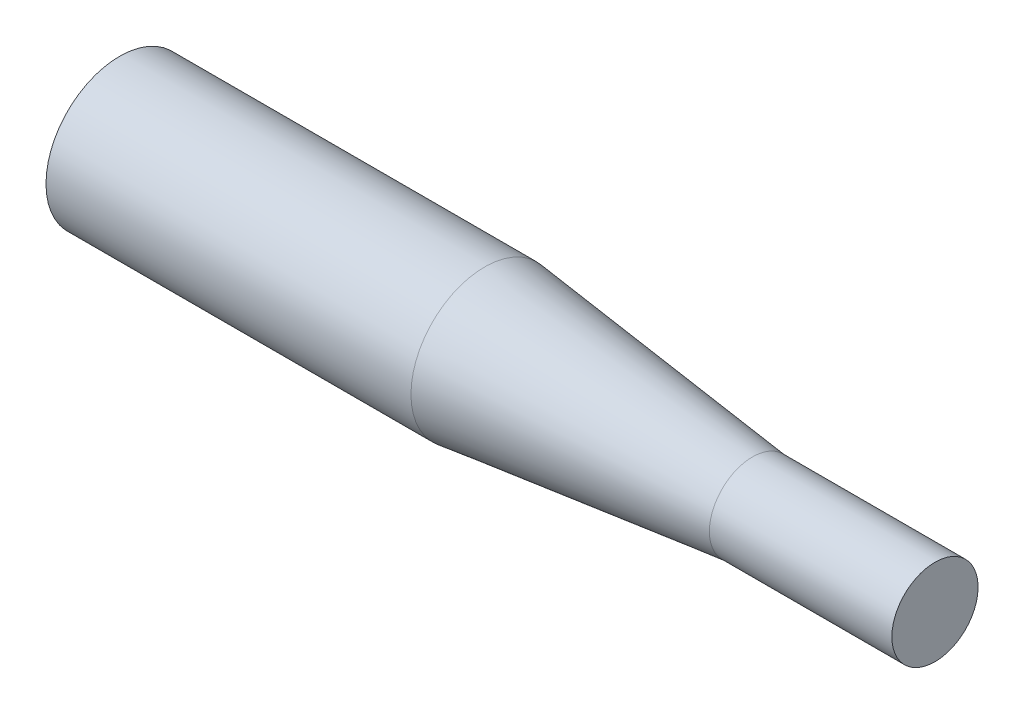
ISO-10303-21;
HEADER;
FILE_DESCRIPTION(('STEP AP214'),'2;1');
FILE_NAME('part.step','',(''),(''),'','','');
FILE_SCHEMA(('AUTOMOTIVE_DESIGN { 1 0 10303 214 1 1 1 1 }'));
ENDSEC;
DATA;
#1=APPLICATION_CONTEXT('core data for automotive mechanical design processes');
#2=APPLICATION_PROTOCOL_DEFINITION('international standard','automotive_design',2000,#1);
#3=PRODUCT_CONTEXT('',#1,'mechanical');
#4=PRODUCT('Part','Part','',(#3));
#5=PRODUCT_RELATED_PRODUCT_CATEGORY('part','',(#4));
#6=PRODUCT_DEFINITION_FORMATION('','',#4);
#7=PRODUCT_DEFINITION_CONTEXT('part definition',#1,'design');
#8=PRODUCT_DEFINITION('design','',#6,#7);
#9=PRODUCT_DEFINITION_SHAPE('','',#8);
#10=(LENGTH_UNIT() NAMED_UNIT(*) SI_UNIT(.MILLI.,.METRE.));
#11=(NAMED_UNIT(*) PLANE_ANGLE_UNIT() SI_UNIT($,.RADIAN.));
#12=(NAMED_UNIT(*) SI_UNIT($,.STERADIAN.) SOLID_ANGLE_UNIT());
#13=UNCERTAINTY_MEASURE_WITH_UNIT(LENGTH_MEASURE(1.E-05),#10,'distance_accuracy_value','');
#14=(GEOMETRIC_REPRESENTATION_CONTEXT(3) GLOBAL_UNCERTAINTY_ASSIGNED_CONTEXT((#13)) GLOBAL_UNIT_ASSIGNED_CONTEXT((#10,
#11,#12)) REPRESENTATION_CONTEXT('',''));
#15=CARTESIAN_POINT('',(0.,0.,0.));
#16=DIRECTION('',(0.,0.,1.));
#17=DIRECTION('',(1.,0.,0.));
#18=AXIS2_PLACEMENT_3D('',#15,#16,#17);
#19=CARTESIAN_POINT('',(-101.6,0.,0.));
#20=DIRECTION('',(1.,0.,0.));
#21=DIRECTION('',(0.,0.,-1.));
#22=AXIS2_PLACEMENT_3D('',#19,#20,#21);
#23=PLANE('',#22);
#24=CARTESIAN_POINT('',(-101.6,0.,0.));
#25=DIRECTION('',(-1.,0.,0.));
#26=DIRECTION('',(0.,0.,1.));
#27=AXIS2_PLACEMENT_3D('',#24,#25,#26);
#28=CIRCLE('',#27,20.4978);
#29=CARTESIAN_POINT('',(-101.6,0.,20.4978));
#30=VERTEX_POINT('',#29);
#31=EDGE_CURVE('E10',#30,#30,#28,.T.);
#32=ORIENTED_EDGE('',*,*,#31,.T.);
#33=EDGE_LOOP('',(#32));
#34=FACE_BOUND('',#33,.T.);
#35=ADVANCED_FACE('F31',(#34),#23,.F.);
#36=CARTESIAN_POINT('',(-121.454105891508,0.,0.));
#37=DIRECTION('',(-1.,0.,0.));
#38=DIRECTION('',(0.,0.,1.));
#39=AXIS2_PLACEMENT_3D('',#36,#37,#38);
#40=CYLINDRICAL_SURFACE('',#39,20.4978);
#41=ORIENTED_EDGE('',*,*,#31,.F.);
#42=EDGE_LOOP('',(#41));
#43=FACE_BOUND('',#42,.T.);
#44=CARTESIAN_POINT('',(0.,0.,0.));
#45=DIRECTION('',(-1.,0.,0.));
#46=DIRECTION('',(0.,0.,1.));
#47=AXIS2_PLACEMENT_3D('',#44,#45,#46);
#48=CIRCLE('',#47,20.4978);
#49=CARTESIAN_POINT('',(0.,0.,20.4978));
#50=VERTEX_POINT('',#49);
#51=EDGE_CURVE('E37',#50,#50,#48,.T.);
#52=ORIENTED_EDGE('',*,*,#51,.T.);
#53=EDGE_LOOP('',(#52));
#54=FACE_BOUND('',#53,.T.);
#55=ADVANCED_FACE('F63',(#43,#54),#40,.T.);
#56=CARTESIAN_POINT('',(74.5842344695433,0.,0.));
#57=DIRECTION('',(-1.,0.,0.));
#58=DIRECTION('',(0.,0.,1.));
#59=AXIS2_PLACEMENT_3D('',#56,#57,#58);
#60=CONICAL_SURFACE('',#59,11.999999876,0.113446401379632);
#61=ORIENTED_EDGE('',*,*,#51,.F.);
#62=EDGE_LOOP('',(#61));
#63=FACE_BOUND('',#62,.T.);
#64=CARTESIAN_POINT('',(74.5842344695433,0.,0.));
#65=DIRECTION('',(-1.,0.,0.));
#66=DIRECTION('',(0.,0.,1.));
#67=AXIS2_PLACEMENT_3D('',#64,#65,#66);
#68=CIRCLE('',#67,11.999999876);
#69=CARTESIAN_POINT('',(74.5842344695433,0.,11.999999876));
#70=VERTEX_POINT('',#69);
#71=EDGE_CURVE('E41',#70,#70,#68,.T.);
#72=ORIENTED_EDGE('',*,*,#71,.T.);
#73=EDGE_LOOP('',(#72));
#74=FACE_BOUND('',#73,.T.);
#75=ADVANCED_FACE('F59',(#63,#74),#60,.T.);
#76=CARTESIAN_POINT('',(-121.454105891508,0.,0.));
#77=DIRECTION('',(-1.,0.,0.));
#78=DIRECTION('',(0.,0.,1.));
#79=AXIS2_PLACEMENT_3D('',#76,#77,#78);
#80=CYLINDRICAL_SURFACE('',#79,11.999999876);
#81=ORIENTED_EDGE('',*,*,#71,.F.);
#82=EDGE_LOOP('',(#81));
#83=FACE_BOUND('',#82,.T.);
#84=CARTESIAN_POINT('',(125.384234469543,0.,0.));
#85=DIRECTION('',(-1.,0.,0.));
#86=DIRECTION('',(0.,0.,1.));
#87=AXIS2_PLACEMENT_3D('',#84,#85,#86);
#88=CIRCLE('',#87,11.999999876);
#89=CARTESIAN_POINT('',(125.384234469543,0.,11.999999876));
#90=VERTEX_POINT('',#89);
#91=EDGE_CURVE('E45',#90,#90,#88,.T.);
#92=ORIENTED_EDGE('',*,*,#91,.T.);
#93=EDGE_LOOP('',(#92));
#94=FACE_BOUND('',#93,.T.);
#95=ADVANCED_FACE('F51',(#83,#94),#80,.T.);
#96=CARTESIAN_POINT('',(125.384234469543,0.,-11.999999876));
#97=DIRECTION('',(-1.,0.,0.));
#98=DIRECTION('',(0.,0.,1.));
#99=AXIS2_PLACEMENT_3D('',#96,#97,#98);
#100=PLANE('',#99);
#101=ORIENTED_EDGE('',*,*,#91,.F.);
#102=EDGE_LOOP('',(#101));
#103=FACE_BOUND('',#102,.T.);
#104=ADVANCED_FACE('F53',(#103),#100,.F.);
#105=CLOSED_SHELL('',(#35,#55,#75,#95,#104));
#106=MANIFOLD_SOLID_BREP('B2',#105);
#107=ADVANCED_BREP_SHAPE_REPRESENTATION('',(#18,#106),#14);
#108=SHAPE_DEFINITION_REPRESENTATION(#9,#107);
ENDSEC;
END-ISO-10303-21;
